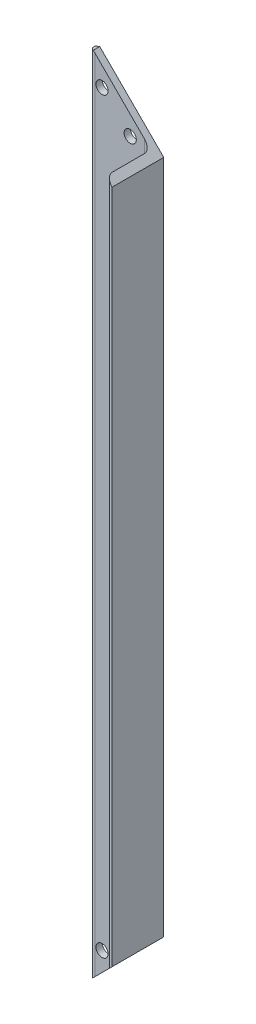
ISO-10303-21;
HEADER;
FILE_DESCRIPTION(('STEP AP214'),'2;1');
FILE_NAME('part.step','',(''),(''),'','','');
FILE_SCHEMA(('AUTOMOTIVE_DESIGN { 1 0 10303 214 1 1 1 1 }'));
ENDSEC;
DATA;
#1=APPLICATION_CONTEXT('core data for automotive mechanical design processes');
#2=APPLICATION_PROTOCOL_DEFINITION('international standard','automotive_design',2000,#1);
#3=PRODUCT_CONTEXT('',#1,'mechanical');
#4=PRODUCT('Part','Part','',(#3));
#5=PRODUCT_RELATED_PRODUCT_CATEGORY('part','',(#4));
#6=PRODUCT_DEFINITION_FORMATION('','',#4);
#7=PRODUCT_DEFINITION_CONTEXT('part definition',#1,'design');
#8=PRODUCT_DEFINITION('design','',#6,#7);
#9=PRODUCT_DEFINITION_SHAPE('','',#8);
#10=(LENGTH_UNIT() NAMED_UNIT(*) SI_UNIT(.MILLI.,.METRE.));
#11=(NAMED_UNIT(*) PLANE_ANGLE_UNIT() SI_UNIT($,.RADIAN.));
#12=(NAMED_UNIT(*) SI_UNIT($,.STERADIAN.) SOLID_ANGLE_UNIT());
#13=UNCERTAINTY_MEASURE_WITH_UNIT(LENGTH_MEASURE(1.E-05),#10,'distance_accuracy_value','');
#14=(GEOMETRIC_REPRESENTATION_CONTEXT(3) GLOBAL_UNCERTAINTY_ASSIGNED_CONTEXT((#13)) GLOBAL_UNIT_ASSIGNED_CONTEXT((#10,
#11,#12)) REPRESENTATION_CONTEXT('',''));
#15=CARTESIAN_POINT('',(0.,0.,0.));
#16=DIRECTION('',(0.,0.,1.));
#17=DIRECTION('',(1.,0.,0.));
#18=AXIS2_PLACEMENT_3D('',#15,#16,#17);
#19=CARTESIAN_POINT('',(-46.0425799999999,-300.,4.76249999999982));
#20=DIRECTION('',(0.,0.,-1.));
#21=DIRECTION('',(-1.,0.,0.));
#22=AXIS2_PLACEMENT_3D('',#19,#20,#21);
#23=PLANE('',#22);
#24=DIRECTION('',(-0.707106781186547,0.707106781186548,0.));
#25=VECTOR('',#24,1.);
#26=CARTESIAN_POINT('',(-47.2644660940671,296.464466094067,4.76249999999981));
#27=LINE('',#26,#25);
#28=CARTESIAN_POINT('',(-9.5249999999999,258.725,4.76249999999995));
#29=VERTEX_POINT('',#28);
#30=CARTESIAN_POINT('',(-46.0425799999999,295.24258,4.76249999999982));
#31=VERTEX_POINT('',#30);
#32=EDGE_CURVE('E180',#29,#31,#27,.T.);
#33=ORIENTED_EDGE('',*,*,#32,.T.);
#34=DIRECTION('',(0.,1.,0.));
#35=VECTOR('',#34,1.);
#36=CARTESIAN_POINT('',(-46.0425799999999,-300.,4.76249999999982));
#37=LINE('',#36,#35);
#38=CARTESIAN_POINT('',(-46.0425799999999,-295.24258,4.76249999999982));
#39=VERTEX_POINT('',#38);
#40=EDGE_CURVE('E186',#39,#31,#37,.T.);
#41=ORIENTED_EDGE('',*,*,#40,.F.);
#42=DIRECTION('',(0.707106781186551,0.707106781186544,0.));
#43=VECTOR('',#42,1.);
#44=CARTESIAN_POINT('',(0.,-249.200000000001,4.76249999999998));
#45=LINE('',#44,#43);
#46=CARTESIAN_POINT('',(-9.52499999999993,-258.725,4.76249999999995));
#47=VERTEX_POINT('',#46);
#48=EDGE_CURVE('E262',#39,#47,#45,.T.);
#49=ORIENTED_EDGE('',*,*,#48,.T.);
#50=DIRECTION('',(0.,1.,0.));
#51=VECTOR('',#50,1.);
#52=CARTESIAN_POINT('',(-9.52499999999993,-300.,4.76249999999995));
#53=LINE('',#52,#51);
#54=EDGE_CURVE('E191',#47,#29,#53,.T.);
#55=ORIENTED_EDGE('',*,*,#54,.T.);
#56=EDGE_LOOP('',(#33,#41,#49,#55));
#57=FACE_BOUND('',#56,.T.);
#58=CARTESIAN_POINT('',(-40.7999999999999,-275.857864376269,4.76249999999998));
#59=DIRECTION('',(0.,0.,1.));
#60=DIRECTION('',(1.,0.,0.));
#61=AXIS2_PLACEMENT_3D('',#58,#59,#60);
#62=CIRCLE('',#61,4.5);
#63=CARTESIAN_POINT('',(-36.2999999999999,-275.857864376269,4.76249999999998));
#64=VERTEX_POINT('',#63);
#65=EDGE_CURVE('E492',#64,#64,#62,.T.);
#66=ORIENTED_EDGE('',*,*,#65,.F.);
#67=EDGE_LOOP('',(#66));
#68=FACE_BOUND('',#67,.T.);
#69=CARTESIAN_POINT('',(-20.00508,-255.062944376269,4.76249999999998));
#70=DIRECTION('',(0.,0.,1.));
#71=DIRECTION('',(1.,0.,0.));
#72=AXIS2_PLACEMENT_3D('',#69,#70,#71);
#73=CIRCLE('',#72,4.5);
#74=CARTESIAN_POINT('',(-15.50508,-255.062944376269,4.76249999999998));
#75=VERTEX_POINT('',#74);
#76=EDGE_CURVE('E484',#75,#75,#73,.T.);
#77=ORIENTED_EDGE('',*,*,#76,.F.);
#78=EDGE_LOOP('',(#77));
#79=FACE_BOUND('',#78,.T.);
#80=CARTESIAN_POINT('',(-20.0050800000001,255.062944376269,4.76249999999998));
#81=DIRECTION('',(0.,0.,1.));
#82=DIRECTION('',(1.,0.,0.));
#83=AXIS2_PLACEMENT_3D('',#80,#81,#82);
#84=CIRCLE('',#83,4.5);
#85=CARTESIAN_POINT('',(-15.5050800000001,255.062944376269,4.76249999999998));
#86=VERTEX_POINT('',#85);
#87=EDGE_CURVE('E474',#86,#86,#84,.T.);
#88=ORIENTED_EDGE('',*,*,#87,.F.);
#89=EDGE_LOOP('',(#88));
#90=FACE_BOUND('',#89,.T.);
#91=CARTESIAN_POINT('',(-40.8,275.857864376269,4.76249999999998));
#92=DIRECTION('',(0.,0.,1.));
#93=DIRECTION('',(1.,0.,0.));
#94=AXIS2_PLACEMENT_3D('',#91,#92,#93);
#95=CIRCLE('',#94,4.5);
#96=CARTESIAN_POINT('',(-36.3,275.857864376269,4.76249999999998));
#97=VERTEX_POINT('',#96);
#98=EDGE_CURVE('E469',#97,#97,#95,.T.);
#99=ORIENTED_EDGE('',*,*,#98,.F.);
#100=EDGE_LOOP('',(#99));
#101=FACE_BOUND('',#100,.T.);
#102=ADVANCED_FACE('F71',(#57,#68,#79,#90,#101),#23,.F.);
#103=CARTESIAN_POINT('',(0.,-300.,38.1));
#104=DIRECTION('',(-1.,0.,0.));
#105=DIRECTION('',(0.,0.,1.));
#106=AXIS2_PLACEMENT_3D('',#103,#104,#105);
#107=PLANE('',#106);
#108=DIRECTION('',(0.,0.,-1.));
#109=VECTOR('',#108,1.);
#110=CARTESIAN_POINT('',(0.,249.2,38.101));
#111=LINE('',#110,#109);
#112=CARTESIAN_POINT('',(0.,249.2,38.1));
#113=VERTEX_POINT('',#112);
#114=CARTESIAN_POINT('',(0.,249.2,0.));
#115=VERTEX_POINT('',#114);
#116=EDGE_CURVE('E95',#113,#115,#111,.T.);
#117=ORIENTED_EDGE('',*,*,#116,.F.);
#118=DIRECTION('',(0.,1.,0.));
#119=VECTOR('',#118,1.);
#120=CARTESIAN_POINT('',(0.,-300.,38.1));
#121=LINE('',#120,#119);
#122=CARTESIAN_POINT('',(0.,-249.200000000001,38.1));
#123=VERTEX_POINT('',#122);
#124=EDGE_CURVE('E13',#123,#113,#121,.T.);
#125=ORIENTED_EDGE('',*,*,#124,.F.);
#126=DIRECTION('',(0.,0.,-1.));
#127=VECTOR('',#126,1.);
#128=CARTESIAN_POINT('',(0.,-249.200000000001,38.101));
#129=LINE('',#128,#127);
#130=CARTESIAN_POINT('',(0.,-249.200000000001,0.));
#131=VERTEX_POINT('',#130);
#132=EDGE_CURVE('E252',#123,#131,#129,.T.);
#133=ORIENTED_EDGE('',*,*,#132,.T.);
#134=DIRECTION('',(0.,1.,0.));
#135=VECTOR('',#134,1.);
#136=CARTESIAN_POINT('',(0.,-300.,0.));
#137=LINE('',#136,#135);
#138=EDGE_CURVE('E168',#131,#115,#137,.T.);
#139=ORIENTED_EDGE('',*,*,#138,.T.);
#140=EDGE_LOOP('',(#117,#125,#133,#139));
#141=FACE_BOUND('',#140,.T.);
#142=ADVANCED_FACE('F73',(#141),#107,.F.);
#143=CARTESIAN_POINT('',(-0.00508000000005188,-300.,38.1));
#144=DIRECTION('',(0.,0.,-1.));
#145=DIRECTION('',(-1.,0.,0.));
#146=AXIS2_PLACEMENT_3D('',#143,#144,#145);
#147=PLANE('',#146);
#148=DIRECTION('',(-0.707106781186547,0.707106781186548,0.));
#149=VECTOR('',#148,1.);
#150=CARTESIAN_POINT('',(-47.2644660940672,296.464466094067,38.1));
#151=LINE('',#150,#149);
#152=CARTESIAN_POINT('',(-0.00508000000005072,249.20508,38.1));
#153=VERTEX_POINT('',#152);
#154=EDGE_CURVE('E222',#113,#153,#151,.T.);
#155=ORIENTED_EDGE('',*,*,#154,.T.);
#156=DIRECTION('',(0.,1.,0.));
#157=VECTOR('',#156,1.);
#158=CARTESIAN_POINT('',(-0.00508000000005072,-300.,38.1));
#159=LINE('',#158,#157);
#160=CARTESIAN_POINT('',(-0.00508000000005072,-249.205080000001,38.1));
#161=VERTEX_POINT('',#160);
#162=EDGE_CURVE('E80',#161,#153,#159,.T.);
#163=ORIENTED_EDGE('',*,*,#162,.F.);
#164=DIRECTION('',(0.707106781186551,0.707106781186544,0.));
#165=VECTOR('',#164,1.);
#166=CARTESIAN_POINT('',(0.,-249.200000000001,38.1));
#167=LINE('',#166,#165);
#168=EDGE_CURVE('E220',#161,#123,#167,.T.);
#169=ORIENTED_EDGE('',*,*,#168,.T.);
#170=ORIENTED_EDGE('',*,*,#124,.T.);
#171=EDGE_LOOP('',(#155,#163,#169,#170));
#172=FACE_BOUND('',#171,.T.);
#173=ADVANCED_FACE('F219',(#172),#147,.F.);
#174=CARTESIAN_POINT('',(-0.0050800000000344,-300.,33.34258));
#175=DIRECTION('',(0.,1.,0.));
#176=DIRECTION('',(0.,0.,1.));
#177=AXIS2_PLACEMENT_3D('',#174,#175,#176);
#178=CYLINDRICAL_SURFACE('',#177,4.75742);
#179=CARTESIAN_POINT('',(-0.0050800000000344,249.20508,33.34258));
#180=DIRECTION('',(0.707106781186548,0.707106781186547,0.));
#181=DIRECTION('',(-0.707106781186547,0.707106781186548,0.));
#182=AXIS2_PLACEMENT_3D('',#179,#180,#181);
#183=ELLIPSE('',#182,6.72800788590501,4.75742);
#184=CARTESIAN_POINT('',(-4.76250000000003,253.9625,33.34258));
#185=VERTEX_POINT('',#184);
#186=EDGE_CURVE('E214',#153,#185,#183,.F.);
#187=ORIENTED_EDGE('',*,*,#186,.T.);
#188=DIRECTION('',(0.,1.,0.));
#189=VECTOR('',#188,1.);
#190=CARTESIAN_POINT('',(-4.76250000000003,-300.,33.34258));
#191=LINE('',#190,#189);
#192=CARTESIAN_POINT('',(-4.76250000000003,-253.962500000001,33.34258));
#193=VERTEX_POINT('',#192);
#194=EDGE_CURVE('E203',#193,#185,#191,.T.);
#195=ORIENTED_EDGE('',*,*,#194,.F.);
#196=CARTESIAN_POINT('',(-0.0050800000000344,-249.205080000001,33.34258));
#197=DIRECTION('',(0.707106781186544,-0.707106781186551,0.));
#198=DIRECTION('',(0.707106781186551,0.707106781186544,0.));
#199=AXIS2_PLACEMENT_3D('',#196,#197,#198);
#200=ELLIPSE('',#199,6.72800788590497,4.75742);
#201=EDGE_CURVE('E215',#193,#161,#200,.F.);
#202=ORIENTED_EDGE('',*,*,#201,.T.);
#203=ORIENTED_EDGE('',*,*,#162,.T.);
#204=EDGE_LOOP('',(#187,#195,#202,#203));
#205=FACE_BOUND('',#204,.T.);
#206=ADVANCED_FACE('F212',(#205),#178,.T.);
#207=CARTESIAN_POINT('',(-4.76249999999995,-300.,9.52499999999996));
#208=DIRECTION('',(1.,0.,0.));
#209=DIRECTION('',(0.,0.,-1.));
#210=AXIS2_PLACEMENT_3D('',#207,#208,#209);
#211=PLANE('',#210);
#212=DIRECTION('',(0.,0.,-1.));
#213=VECTOR('',#212,1.);
#214=CARTESIAN_POINT('',(-4.76250000000005,253.9625,38.1010000000003));
#215=LINE('',#214,#213);
#216=CARTESIAN_POINT('',(-4.76249999999995,253.9625,9.52499999999996));
#217=VERTEX_POINT('',#216);
#218=EDGE_CURVE('E229',#185,#217,#215,.T.);
#219=ORIENTED_EDGE('',*,*,#218,.T.);
#220=DIRECTION('',(0.,1.,0.));
#221=VECTOR('',#220,1.);
#222=CARTESIAN_POINT('',(-4.76249999999995,-300.,9.52499999999996));
#223=LINE('',#222,#221);
#224=CARTESIAN_POINT('',(-4.76249999999995,-253.9625,9.52499999999996));
#225=VERTEX_POINT('',#224);
#226=EDGE_CURVE('E199',#225,#217,#223,.T.);
#227=ORIENTED_EDGE('',*,*,#226,.F.);
#228=DIRECTION('',(0.,0.,1.));
#229=VECTOR('',#228,1.);
#230=CARTESIAN_POINT('',(-4.76250000000005,-253.962500000001,38.101));
#231=LINE('',#230,#229);
#232=EDGE_CURVE('E270',#225,#193,#231,.T.);
#233=ORIENTED_EDGE('',*,*,#232,.T.);
#234=ORIENTED_EDGE('',*,*,#194,.T.);
#235=EDGE_LOOP('',(#219,#227,#233,#234));
#236=FACE_BOUND('',#235,.T.);
#237=ADVANCED_FACE('F318',(#236),#211,.F.);
#238=CARTESIAN_POINT('',(-9.52499999999995,-300.,9.52499999999995));
#239=DIRECTION('',(0.,1.,0.));
#240=DIRECTION('',(0.,0.,1.));
#241=AXIS2_PLACEMENT_3D('',#238,#239,#240);
#242=CYLINDRICAL_SURFACE('',#241,4.7625);
#243=CARTESIAN_POINT('',(-9.52499999999995,258.725,9.52499999999995));
#244=DIRECTION('',(0.707106781186548,0.707106781186547,0.));
#245=DIRECTION('',(-0.707106781186547,0.707106781186548,0.));
#246=AXIS2_PLACEMENT_3D('',#243,#244,#245);
#247=ELLIPSE('',#246,6.73519209080187,4.7625);
#248=EDGE_CURVE('E293',#217,#29,#247,.T.);
#249=ORIENTED_EDGE('',*,*,#248,.T.);
#250=ORIENTED_EDGE('',*,*,#54,.F.);
#251=CARTESIAN_POINT('',(-9.52499999999995,-258.725,9.52499999999995));
#252=DIRECTION('',(0.707106781186544,-0.707106781186551,0.));
#253=DIRECTION('',(0.707106781186551,0.707106781186544,0.));
#254=AXIS2_PLACEMENT_3D('',#251,#252,#253);
#255=ELLIPSE('',#254,6.73519209080183,4.7625);
#256=EDGE_CURVE('E266',#47,#225,#255,.T.);
#257=ORIENTED_EDGE('',*,*,#256,.T.);
#258=ORIENTED_EDGE('',*,*,#226,.T.);
#259=EDGE_LOOP('',(#249,#250,#257,#258));
#260=FACE_BOUND('',#259,.T.);
#261=ADVANCED_FACE('F315',(#260),#242,.F.);
#262=CARTESIAN_POINT('',(-46.0425799999999,-300.,0.00507999999981601));
#263=DIRECTION('',(0.,1.,0.));
#264=DIRECTION('',(0.,0.,1.));
#265=AXIS2_PLACEMENT_3D('',#262,#263,#264);
#266=CYLINDRICAL_SURFACE('',#265,4.75742);
#267=CARTESIAN_POINT('',(-46.0425799999999,296.970587885905,0.00507999999981601));
#268=DIRECTION('',(-0.382683432365079,0.923879532511291,0.));
#269=DIRECTION('',(0.923879532511292,0.382683432365079,0.));
#270=AXIS2_PLACEMENT_3D('',#267,#268,#269);
#271=ELLIPSE('',#270,5.14939430151502,4.75742);
#272=CARTESIAN_POINT('',(-47.2644660940672,296.464466094067,4.60290986087168));
#273=VERTEX_POINT('',#272);
#274=CARTESIAN_POINT('',(-50.7999999999999,295.,0.00507999999979767));
#275=VERTEX_POINT('',#274);
#276=EDGE_CURVE('E159',#273,#275,#271,.F.);
#277=ORIENTED_EDGE('',*,*,#276,.T.);
#278=DIRECTION('',(0.,1.,0.));
#279=VECTOR('',#278,1.);
#280=CARTESIAN_POINT('',(-50.7999999999999,-300.,0.00507999999979767));
#281=LINE('',#280,#279);
#282=CARTESIAN_POINT('',(-50.7999999999999,-295.,0.00507999999979767));
#283=VERTEX_POINT('',#282);
#284=EDGE_CURVE('E176',#283,#275,#281,.T.);
#285=ORIENTED_EDGE('',*,*,#284,.F.);
#286=CARTESIAN_POINT('',(-46.0425799999999,-299.75742,0.00507999999981601));
#287=DIRECTION('',(-0.70710678118655,-0.707106781186546,0.));
#288=DIRECTION('',(-0.707106781186546,0.70710678118655,0.));
#289=AXIS2_PLACEMENT_3D('',#286,#287,#288);
#290=ELLIPSE('',#289,6.72800788590503,4.75742);
#291=CARTESIAN_POINT('',(-48.2999999999999,-297.5,4.1928120831207));
#292=VERTEX_POINT('',#291);
#293=EDGE_CURVE('E239',#283,#292,#290,.F.);
#294=ORIENTED_EDGE('',*,*,#293,.T.);
#295=CARTESIAN_POINT('',(-46.0425799999999,-295.24258,0.00507999999981601));
#296=DIRECTION('',(0.707106781186544,-0.707106781186551,0.));
#297=DIRECTION('',(0.707106781186551,0.707106781186544,0.));
#298=AXIS2_PLACEMENT_3D('',#295,#296,#297);
#299=ELLIPSE('',#298,6.72800788590498,4.75742);
#300=EDGE_CURVE('E258',#292,#39,#299,.F.);
#301=ORIENTED_EDGE('',*,*,#300,.T.);
#302=ORIENTED_EDGE('',*,*,#40,.T.);
#303=CARTESIAN_POINT('',(-46.0425799999999,295.24258,0.00507999999981601));
#304=DIRECTION('',(0.707106781186548,0.707106781186547,0.));
#305=DIRECTION('',(-0.707106781186547,0.707106781186548,0.));
#306=AXIS2_PLACEMENT_3D('',#303,#304,#305);
#307=ELLIPSE('',#306,6.72800788590502,4.75742);
#308=EDGE_CURVE('E178',#31,#273,#307,.F.);
#309=ORIENTED_EDGE('',*,*,#308,.T.);
#310=EDGE_LOOP('',(#277,#285,#294,#301,#302,#309));
#311=FACE_BOUND('',#310,.T.);
#312=ADVANCED_FACE('F174',(#311),#266,.T.);
#313=CARTESIAN_POINT('',(-50.7999999999999,-300.,-2.02252074971905E-13));
#314=DIRECTION('',(1.,0.,0.));
#315=DIRECTION('',(0.,0.,-1.));
#316=AXIS2_PLACEMENT_3D('',#313,#314,#315);
#317=PLANE('',#316);
#318=DIRECTION('',(0.,0.,-1.));
#319=VECTOR('',#318,1.);
#320=CARTESIAN_POINT('',(-50.7999999999999,295.,38.101));
#321=LINE('',#320,#319);
#322=CARTESIAN_POINT('',(-50.7999999999999,295.,0.));
#323=VERTEX_POINT('',#322);
#324=EDGE_CURVE('E156',#275,#323,#321,.T.);
#325=ORIENTED_EDGE('',*,*,#324,.T.);
#326=DIRECTION('',(0.,1.,0.));
#327=VECTOR('',#326,1.);
#328=CARTESIAN_POINT('',(-50.7999999999999,-300.,-2.02252074971905E-13));
#329=LINE('',#328,#327);
#330=CARTESIAN_POINT('',(-50.7999999999999,-295.,0.));
#331=VERTEX_POINT('',#330);
#332=EDGE_CURVE('E187',#331,#323,#329,.T.);
#333=ORIENTED_EDGE('',*,*,#332,.F.);
#334=DIRECTION('',(0.,0.,-1.));
#335=VECTOR('',#334,1.);
#336=CARTESIAN_POINT('',(-50.7999999999999,-295.,38.101));
#337=LINE('',#336,#335);
#338=EDGE_CURVE('E184',#283,#331,#337,.T.);
#339=ORIENTED_EDGE('',*,*,#338,.F.);
#340=ORIENTED_EDGE('',*,*,#284,.T.);
#341=EDGE_LOOP('',(#325,#333,#339,#340));
#342=FACE_BOUND('',#341,.T.);
#343=ADVANCED_FACE('F183',(#342),#317,.F.);
#344=CARTESIAN_POINT('',(0.,-300.,0.));
#345=DIRECTION('',(0.,0.,1.));
#346=DIRECTION('',(1.,0.,0.));
#347=AXIS2_PLACEMENT_3D('',#344,#345,#346);
#348=PLANE('',#347);
#349=CARTESIAN_POINT('',(-40.8,275.857864376269,-1.62196645003831E-13));
#350=DIRECTION('',(0.,0.,1.));
#351=DIRECTION('',(1.,0.,0.));
#352=AXIS2_PLACEMENT_3D('',#349,#350,#351);
#353=CIRCLE('',#352,4.5);
#354=CARTESIAN_POINT('',(-36.3,275.857864376269,-1.44280614740572E-13));
#355=VERTEX_POINT('',#354);
#356=EDGE_CURVE('E466',#355,#355,#353,.T.);
#357=ORIENTED_EDGE('',*,*,#356,.T.);
#358=EDGE_LOOP('',(#357));
#359=FACE_BOUND('',#358,.T.);
#360=CARTESIAN_POINT('',(-20.0050800000001,255.062944376269,0.));
#361=DIRECTION('',(0.,0.,1.));
#362=DIRECTION('',(1.,0.,0.));
#363=AXIS2_PLACEMENT_3D('',#360,#361,#362);
#364=CIRCLE('',#363,4.5);
#365=CARTESIAN_POINT('',(-15.5050800000001,255.062944376269,0.));
#366=VERTEX_POINT('',#365);
#367=EDGE_CURVE('E480',#366,#366,#364,.T.);
#368=ORIENTED_EDGE('',*,*,#367,.T.);
#369=EDGE_LOOP('',(#368));
#370=FACE_BOUND('',#369,.T.);
#371=CARTESIAN_POINT('',(-20.00508,-255.062944376269,0.));
#372=DIRECTION('',(0.,0.,1.));
#373=DIRECTION('',(1.,0.,0.));
#374=AXIS2_PLACEMENT_3D('',#371,#372,#373);
#375=CIRCLE('',#374,4.5);
#376=CARTESIAN_POINT('',(-15.50508,-255.062944376269,0.));
#377=VERTEX_POINT('',#376);
#378=EDGE_CURVE('E488',#377,#377,#375,.T.);
#379=ORIENTED_EDGE('',*,*,#378,.T.);
#380=EDGE_LOOP('',(#379));
#381=FACE_BOUND('',#380,.T.);
#382=CARTESIAN_POINT('',(-40.7999999999999,-275.857864376269,-1.62196645003831E-13));
#383=DIRECTION('',(0.,0.,1.));
#384=DIRECTION('',(1.,0.,0.));
#385=AXIS2_PLACEMENT_3D('',#382,#383,#384);
#386=CIRCLE('',#385,4.5);
#387=CARTESIAN_POINT('',(-36.2999999999999,-275.857864376269,-1.44280614740572E-13));
#388=VERTEX_POINT('',#387);
#389=EDGE_CURVE('E242',#388,#388,#386,.T.);
#390=ORIENTED_EDGE('',*,*,#389,.T.);
#391=EDGE_LOOP('',(#390));
#392=FACE_BOUND('',#391,.T.);
#393=DIRECTION('',(0.923879532511291,0.382683432365079,0.));
#394=VECTOR('',#393,1.);
#395=CARTESIAN_POINT('',(-50.7999999999999,295.,0.));
#396=LINE('',#395,#394);
#397=CARTESIAN_POINT('',(-47.2644660940672,296.464466094067,0.));
#398=VERTEX_POINT('',#397);
#399=EDGE_CURVE('E162',#323,#398,#396,.T.);
#400=ORIENTED_EDGE('',*,*,#399,.T.);
#401=DIRECTION('',(0.707106781186547,-0.707106781186548,0.));
#402=VECTOR('',#401,1.);
#403=CARTESIAN_POINT('',(-47.2644660940672,296.464466094067,0.));
#404=LINE('',#403,#402);
#405=EDGE_CURVE('E227',#398,#115,#404,.T.);
#406=ORIENTED_EDGE('',*,*,#405,.T.);
#407=ORIENTED_EDGE('',*,*,#138,.F.);
#408=DIRECTION('',(-0.707106781186551,-0.707106781186544,0.));
#409=VECTOR('',#408,1.);
#410=CARTESIAN_POINT('',(0.,-249.200000000001,0.));
#411=LINE('',#410,#409);
#412=CARTESIAN_POINT('',(-48.2999999999999,-297.5,-1.9229872482565E-13));
#413=VERTEX_POINT('',#412);
#414=EDGE_CURVE('E245',#131,#413,#411,.T.);
#415=ORIENTED_EDGE('',*,*,#414,.T.);
#416=DIRECTION('',(-0.707106781186546,0.707106781186549,0.));
#417=VECTOR('',#416,1.);
#418=CARTESIAN_POINT('',(-48.2999999999999,-297.5,0.));
#419=LINE('',#418,#417);
#420=EDGE_CURVE('E87',#413,#331,#419,.T.);
#421=ORIENTED_EDGE('',*,*,#420,.T.);
#422=ORIENTED_EDGE('',*,*,#332,.T.);
#423=EDGE_LOOP('',(#400,#406,#407,#415,#421,#422));
#424=FACE_BOUND('',#423,.T.);
#425=ADVANCED_FACE('F282',(#359,#370,#381,#392,#424),#348,.F.);
#426=CARTESIAN_POINT('',(-48.2999999999999,-297.5,38.101));
#427=DIRECTION('',(-0.70710678118655,-0.707106781186546,0.));
#428=DIRECTION('',(0.707106781186546,-0.70710678118655,0.));
#429=AXIS2_PLACEMENT_3D('',#426,#427,#428);
#430=PLANE('',#429);
#431=ORIENTED_EDGE('',*,*,#338,.T.);
#432=ORIENTED_EDGE('',*,*,#420,.F.);
#433=DIRECTION('',(0.,0.,-1.));
#434=VECTOR('',#433,1.);
#435=CARTESIAN_POINT('',(-48.2999999999999,-297.5,38.101));
#436=LINE('',#435,#434);
#437=EDGE_CURVE('E249',#292,#413,#436,.T.);
#438=ORIENTED_EDGE('',*,*,#437,.F.);
#439=ORIENTED_EDGE('',*,*,#293,.F.);
#440=EDGE_LOOP('',(#431,#432,#438,#439));
#441=FACE_BOUND('',#440,.T.);
#442=ADVANCED_FACE('F297',(#441),#430,.T.);
#443=CARTESIAN_POINT('',(0.,-249.200000000001,38.101));
#444=DIRECTION('',(0.707106781186544,-0.707106781186551,0.));
#445=DIRECTION('',(0.707106781186551,0.707106781186544,0.));
#446=AXIS2_PLACEMENT_3D('',#443,#444,#445);
#447=PLANE('',#446);
#448=ORIENTED_EDGE('',*,*,#201,.F.);
#449=ORIENTED_EDGE('',*,*,#232,.F.);
#450=ORIENTED_EDGE('',*,*,#256,.F.);
#451=ORIENTED_EDGE('',*,*,#48,.F.);
#452=ORIENTED_EDGE('',*,*,#300,.F.);
#453=ORIENTED_EDGE('',*,*,#437,.T.);
#454=ORIENTED_EDGE('',*,*,#414,.F.);
#455=ORIENTED_EDGE('',*,*,#132,.F.);
#456=ORIENTED_EDGE('',*,*,#168,.F.);
#457=EDGE_LOOP('',(#448,#449,#450,#451,#452,#453,#454,#455,#456));
#458=FACE_BOUND('',#457,.T.);
#459=ADVANCED_FACE('F296',(#458),#447,.T.);
#460=CARTESIAN_POINT('',(-50.7999999999999,295.,38.101));
#461=DIRECTION('',(-0.382683432365079,0.923879532511291,0.));
#462=DIRECTION('',(-0.923879532511292,-0.382683432365079,0.));
#463=AXIS2_PLACEMENT_3D('',#460,#461,#462);
#464=PLANE('',#463);
#465=DIRECTION('',(0.,0.,-1.));
#466=VECTOR('',#465,1.);
#467=CARTESIAN_POINT('',(-47.2644660940672,296.464466094067,38.101));
#468=LINE('',#467,#466);
#469=EDGE_CURVE('E169',#273,#398,#468,.T.);
#470=ORIENTED_EDGE('',*,*,#469,.T.);
#471=ORIENTED_EDGE('',*,*,#399,.F.);
#472=ORIENTED_EDGE('',*,*,#324,.F.);
#473=ORIENTED_EDGE('',*,*,#276,.F.);
#474=EDGE_LOOP('',(#470,#471,#472,#473));
#475=FACE_BOUND('',#474,.T.);
#476=ADVANCED_FACE('F158',(#475),#464,.T.);
#477=CARTESIAN_POINT('',(-47.2644660940672,296.464466094067,38.101));
#478=DIRECTION('',(0.707106781186548,0.707106781186547,0.));
#479=DIRECTION('',(-0.707106781186547,0.707106781186548,0.));
#480=AXIS2_PLACEMENT_3D('',#477,#478,#479);
#481=PLANE('',#480);
#482=ORIENTED_EDGE('',*,*,#116,.T.);
#483=ORIENTED_EDGE('',*,*,#405,.F.);
#484=ORIENTED_EDGE('',*,*,#469,.F.);
#485=ORIENTED_EDGE('',*,*,#308,.F.);
#486=ORIENTED_EDGE('',*,*,#32,.F.);
#487=ORIENTED_EDGE('',*,*,#248,.F.);
#488=ORIENTED_EDGE('',*,*,#218,.F.);
#489=ORIENTED_EDGE('',*,*,#186,.F.);
#490=ORIENTED_EDGE('',*,*,#154,.F.);
#491=EDGE_LOOP('',(#482,#483,#484,#485,#486,#487,#488,#489,#490));
#492=FACE_BOUND('',#491,.T.);
#493=ADVANCED_FACE('F283',(#492),#481,.T.);
#494=CARTESIAN_POINT('',(-40.7999999999999,-275.857864376269,4.76249999999998));
#495=DIRECTION('',(0.,0.,1.));
#496=DIRECTION('',(1.,0.,0.));
#497=AXIS2_PLACEMENT_3D('',#494,#495,#496);
#498=CYLINDRICAL_SURFACE('',#497,4.5);
#499=ORIENTED_EDGE('',*,*,#389,.F.);
#500=EDGE_LOOP('',(#499));
#501=FACE_BOUND('',#500,.T.);
#502=ORIENTED_EDGE('',*,*,#65,.T.);
#503=EDGE_LOOP('',(#502));
#504=FACE_BOUND('',#503,.T.);
#505=ADVANCED_FACE('F364',(#501,#504),#498,.F.);
#506=CARTESIAN_POINT('',(-20.00508,-255.062944376269,4.76249999999998));
#507=DIRECTION('',(0.,0.,1.));
#508=DIRECTION('',(1.,0.,0.));
#509=AXIS2_PLACEMENT_3D('',#506,#507,#508);
#510=CYLINDRICAL_SURFACE('',#509,4.5);
#511=ORIENTED_EDGE('',*,*,#378,.F.);
#512=EDGE_LOOP('',(#511));
#513=FACE_BOUND('',#512,.T.);
#514=ORIENTED_EDGE('',*,*,#76,.T.);
#515=EDGE_LOOP('',(#514));
#516=FACE_BOUND('',#515,.T.);
#517=ADVANCED_FACE('F369',(#513,#516),#510,.F.);
#518=CARTESIAN_POINT('',(-20.0050800000001,255.062944376269,4.76249999999998));
#519=DIRECTION('',(0.,0.,1.));
#520=DIRECTION('',(1.,0.,0.));
#521=AXIS2_PLACEMENT_3D('',#518,#519,#520);
#522=CYLINDRICAL_SURFACE('',#521,4.5);
#523=ORIENTED_EDGE('',*,*,#367,.F.);
#524=EDGE_LOOP('',(#523));
#525=FACE_BOUND('',#524,.T.);
#526=ORIENTED_EDGE('',*,*,#87,.T.);
#527=EDGE_LOOP('',(#526));
#528=FACE_BOUND('',#527,.T.);
#529=ADVANCED_FACE('F380',(#525,#528),#522,.F.);
#530=CARTESIAN_POINT('',(-40.8,275.857864376269,4.76249999999998));
#531=DIRECTION('',(0.,0.,1.));
#532=DIRECTION('',(1.,0.,0.));
#533=AXIS2_PLACEMENT_3D('',#530,#531,#532);
#534=CYLINDRICAL_SURFACE('',#533,4.5);
#535=ORIENTED_EDGE('',*,*,#356,.F.);
#536=EDGE_LOOP('',(#535));
#537=FACE_BOUND('',#536,.T.);
#538=ORIENTED_EDGE('',*,*,#98,.T.);
#539=EDGE_LOOP('',(#538));
#540=FACE_BOUND('',#539,.T.);
#541=ADVANCED_FACE('F390',(#537,#540),#534,.F.);
#542=CLOSED_SHELL('',(#102,#142,#173,#206,#237,#261,#312,#343,#425,#442,#459,#476,#493,#505,
#517,#529,#541));
#543=MANIFOLD_SOLID_BREP('B2',#542);
#544=ADVANCED_BREP_SHAPE_REPRESENTATION('',(#18,#543),#14);
#545=SHAPE_DEFINITION_REPRESENTATION(#9,#544);
ENDSEC;
END-ISO-10303-21;
